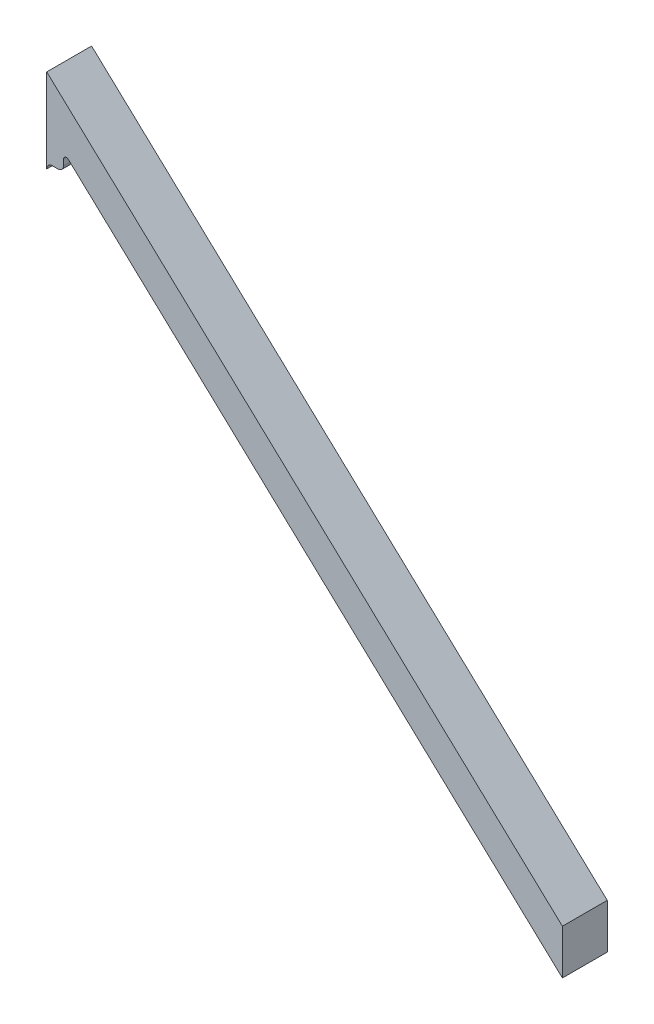
ISO-10303-21;
HEADER;
FILE_DESCRIPTION(('STEP AP214'),'2;1');
FILE_NAME('part.step','',(''),(''),'','','');
FILE_SCHEMA(('AUTOMOTIVE_DESIGN { 1 0 10303 214 1 1 1 1 }'));
ENDSEC;
DATA;
#1=APPLICATION_CONTEXT('core data for automotive mechanical design processes');
#2=APPLICATION_PROTOCOL_DEFINITION('international standard','automotive_design',2000,#1);
#3=PRODUCT_CONTEXT('',#1,'mechanical');
#4=PRODUCT('Part','Part','',(#3));
#5=PRODUCT_RELATED_PRODUCT_CATEGORY('part','',(#4));
#6=PRODUCT_DEFINITION_FORMATION('','',#4);
#7=PRODUCT_DEFINITION_CONTEXT('part definition',#1,'design');
#8=PRODUCT_DEFINITION('design','',#6,#7);
#9=PRODUCT_DEFINITION_SHAPE('','',#8);
#10=(LENGTH_UNIT() NAMED_UNIT(*) SI_UNIT(.MILLI.,.METRE.));
#11=(NAMED_UNIT(*) PLANE_ANGLE_UNIT() SI_UNIT($,.RADIAN.));
#12=(NAMED_UNIT(*) SI_UNIT($,.STERADIAN.) SOLID_ANGLE_UNIT());
#13=UNCERTAINTY_MEASURE_WITH_UNIT(LENGTH_MEASURE(1.E-05),#10,'distance_accuracy_value','');
#14=(GEOMETRIC_REPRESENTATION_CONTEXT(3) GLOBAL_UNCERTAINTY_ASSIGNED_CONTEXT((#13)) GLOBAL_UNIT_ASSIGNED_CONTEXT((#10,
#11,#12)) REPRESENTATION_CONTEXT('',''));
#15=CARTESIAN_POINT('',(0.,0.,0.));
#16=DIRECTION('',(0.,0.,1.));
#17=DIRECTION('',(1.,0.,0.));
#18=AXIS2_PLACEMENT_3D('',#15,#16,#17);
#19=CARTESIAN_POINT('',(17.7568132742083,196.880197559472,-8.00999999999998));
#20=DIRECTION('',(-1.,0.,0.));
#21=DIRECTION('',(0.,-1.,0.));
#22=AXIS2_PLACEMENT_3D('',#19,#20,#21);
#23=PLANE('',#22);
#24=DIRECTION('',(0.,1.,0.));
#25=VECTOR('',#24,1.);
#26=CARTESIAN_POINT('',(17.7568132742083,192.880197559472,-7.99999999999997));
#27=LINE('',#26,#25);
#28=CARTESIAN_POINT('',(17.7568132742083,181.880197559472,-7.99999999999998));
#29=VERTEX_POINT('',#28);
#30=CARTESIAN_POINT('',(17.7568132742083,196.880197559472,-7.99999999999998));
#31=VERTEX_POINT('',#30);
#32=EDGE_CURVE('E133',#29,#31,#27,.T.);
#33=ORIENTED_EDGE('',*,*,#32,.F.);
#34=DIRECTION('',(0.,0.,1.));
#35=VECTOR('',#34,1.);
#36=CARTESIAN_POINT('',(17.7568132742083,181.880197559472,0.));
#37=LINE('',#36,#35);
#38=CARTESIAN_POINT('',(17.7568132742083,181.880197559472,0.));
#39=VERTEX_POINT('',#38);
#40=EDGE_CURVE('E47',#29,#39,#37,.T.);
#41=ORIENTED_EDGE('',*,*,#40,.T.);
#42=DIRECTION('',(0.,1.,0.));
#43=VECTOR('',#42,1.);
#44=CARTESIAN_POINT('',(17.7568132742083,0.,0.));
#45=LINE('',#44,#43);
#46=CARTESIAN_POINT('',(17.7568132742083,196.880197559472,0.));
#47=VERTEX_POINT('',#46);
#48=EDGE_CURVE('E130',#39,#47,#45,.T.);
#49=ORIENTED_EDGE('',*,*,#48,.T.);
#50=DIRECTION('',(0.,0.,1.));
#51=VECTOR('',#50,1.);
#52=CARTESIAN_POINT('',(17.7568132742083,196.880197559472,-174.481230173254));
#53=LINE('',#52,#51);
#54=EDGE_CURVE('E62',#31,#47,#53,.T.);
#55=ORIENTED_EDGE('',*,*,#54,.F.);
#56=EDGE_LOOP('',(#33,#41,#49,#55));
#57=FACE_BOUND('',#56,.T.);
#58=ADVANCED_FACE('F43',(#57),#23,.T.);
#59=CARTESIAN_POINT('',(9.75681327420833,192.880197559472,-7.99999999999997));
#60=DIRECTION('',(0.,0.,-1.));
#61=DIRECTION('',(0.,-1.,0.));
#62=AXIS2_PLACEMENT_3D('',#59,#60,#61);
#63=PLANE('',#62);
#64=CARTESIAN_POINT('',(18.7568132742083,181.880197559472,-7.99999999999998));
#65=DIRECTION('',(0.,0.,-1.));
#66=DIRECTION('',(0.,1.,0.));
#67=AXIS2_PLACEMENT_3D('',#64,#65,#66);
#68=CIRCLE('',#67,1.);
#69=CARTESIAN_POINT('',(18.7568132742083,182.880197559472,-7.99999999999998));
#70=VERTEX_POINT('',#69);
#71=EDGE_CURVE('E127',#70,#29,#68,.F.);
#72=ORIENTED_EDGE('',*,*,#71,.T.);
#73=ORIENTED_EDGE('',*,*,#32,.T.);
#74=DIRECTION('',(-0.730526939324927,0.682883878064606,0.));
#75=VECTOR('',#74,1.);
#76=CARTESIAN_POINT('',(17.7568132742084,196.880197559472,-7.99999999999998));
#77=LINE('',#76,#75);
#78=CARTESIAN_POINT('',(109.756813274208,110.880197559472,-7.99999999999998));
#79=VERTEX_POINT('',#78);
#80=EDGE_CURVE('E141',#79,#31,#77,.T.);
#81=ORIENTED_EDGE('',*,*,#80,.F.);
#82=DIRECTION('',(0.,1.,0.));
#83=VECTOR('',#82,1.);
#84=CARTESIAN_POINT('',(109.756813274208,110.880197559472,-7.99999999999998));
#85=LINE('',#84,#83);
#86=CARTESIAN_POINT('',(109.756813274208,102.880197559472,-7.99999999999998));
#87=VERTEX_POINT('',#86);
#88=EDGE_CURVE('E160',#87,#79,#85,.T.);
#89=ORIENTED_EDGE('',*,*,#88,.F.);
#90=DIRECTION('',(0.730526939324927,-0.682883878064605,0.));
#91=VECTOR('',#90,1.);
#92=CARTESIAN_POINT('',(20.7568132742084,186.075849733385,-7.99999999999998));
#93=LINE('',#92,#91);
#94=CARTESIAN_POINT('',(21.5982552132406,185.289284442551,-7.99999999999998));
#95=VERTEX_POINT('',#94);
#96=EDGE_CURVE('E145',#95,#87,#93,.T.);
#97=ORIENTED_EDGE('',*,*,#96,.F.);
#98=CARTESIAN_POINT('',(21.2568132742083,184.924020972888,-7.99999999999998));
#99=DIRECTION('',(0.,0.,-1.));
#100=DIRECTION('',(0.,1.,0.));
#101=AXIS2_PLACEMENT_3D('',#98,#99,#100);
#102=CIRCLE('',#101,0.5);
#103=CARTESIAN_POINT('',(20.7568132742083,184.924020972888,-7.99999999999998));
#104=VERTEX_POINT('',#103);
#105=EDGE_CURVE('E135',#95,#104,#102,.F.);
#106=ORIENTED_EDGE('',*,*,#105,.T.);
#107=DIRECTION('',(0.,1.,0.));
#108=VECTOR('',#107,1.);
#109=CARTESIAN_POINT('',(20.7568132742083,186.075849733385,-7.99999999999998));
#110=LINE('',#109,#108);
#111=CARTESIAN_POINT('',(20.7568132742083,183.880197559472,-7.99999999999998));
#112=VERTEX_POINT('',#111);
#113=EDGE_CURVE('E153',#112,#104,#110,.T.);
#114=ORIENTED_EDGE('',*,*,#113,.F.);
#115=CARTESIAN_POINT('',(19.7568132742083,183.880197559472,-7.99999999999998));
#116=DIRECTION('',(0.,0.,-1.));
#117=DIRECTION('',(0.,1.,0.));
#118=AXIS2_PLACEMENT_3D('',#115,#116,#117);
#119=CIRCLE('',#118,1.);
#120=CARTESIAN_POINT('',(19.7568132742083,182.880197559472,-7.99999999999998));
#121=VERTEX_POINT('',#120);
#122=EDGE_CURVE('E167',#112,#121,#119,.T.);
#123=ORIENTED_EDGE('',*,*,#122,.T.);
#124=DIRECTION('',(1.,0.,0.));
#125=VECTOR('',#124,1.);
#126=CARTESIAN_POINT('',(20.7568132742083,182.880197559472,-7.99999999999998));
#127=LINE('',#126,#125);
#128=EDGE_CURVE('E142',#70,#121,#127,.T.);
#129=ORIENTED_EDGE('',*,*,#128,.F.);
#130=EDGE_LOOP('',(#72,#73,#81,#89,#97,#106,#114,#123,#129));
#131=FACE_BOUND('',#130,.T.);
#132=ADVANCED_FACE('F192',(#131),#63,.T.);
#133=CARTESIAN_POINT('',(0.,0.,0.));
#134=DIRECTION('',(0.,0.,-1.));
#135=DIRECTION('',(-1.,0.,0.));
#136=AXIS2_PLACEMENT_3D('',#133,#134,#135);
#137=PLANE('',#136);
#138=ORIENTED_EDGE('',*,*,#48,.F.);
#139=CARTESIAN_POINT('',(18.7568132742083,181.880197559472,0.));
#140=DIRECTION('',(0.,0.,-1.));
#141=DIRECTION('',(-1.,0.,0.));
#142=AXIS2_PLACEMENT_3D('',#139,#140,#141);
#143=CIRCLE('',#142,1.);
#144=CARTESIAN_POINT('',(18.7568132742083,182.880197559472,0.));
#145=VERTEX_POINT('',#144);
#146=EDGE_CURVE('E119',#39,#145,#143,.T.);
#147=ORIENTED_EDGE('',*,*,#146,.T.);
#148=DIRECTION('',(1.,0.,0.));
#149=VECTOR('',#148,1.);
#150=CARTESIAN_POINT('',(20.7568132742083,182.880197559472,0.));
#151=LINE('',#150,#149);
#152=CARTESIAN_POINT('',(19.7568132742083,182.880197559472,0.));
#153=VERTEX_POINT('',#152);
#154=EDGE_CURVE('E143',#145,#153,#151,.T.);
#155=ORIENTED_EDGE('',*,*,#154,.T.);
#156=CARTESIAN_POINT('',(19.7568132742083,183.880197559472,0.));
#157=DIRECTION('',(0.,0.,-1.));
#158=DIRECTION('',(-1.,0.,0.));
#159=AXIS2_PLACEMENT_3D('',#156,#157,#158);
#160=CIRCLE('',#159,1.);
#161=CARTESIAN_POINT('',(20.7568132742083,183.880197559472,0.));
#162=VERTEX_POINT('',#161);
#163=EDGE_CURVE('E83',#153,#162,#160,.F.);
#164=ORIENTED_EDGE('',*,*,#163,.T.);
#165=DIRECTION('',(0.,1.,0.));
#166=VECTOR('',#165,1.);
#167=CARTESIAN_POINT('',(20.7568132742083,186.075849733385,0.));
#168=LINE('',#167,#166);
#169=CARTESIAN_POINT('',(20.7568132742083,184.924020972888,0.));
#170=VERTEX_POINT('',#169);
#171=EDGE_CURVE('E11',#162,#170,#168,.T.);
#172=ORIENTED_EDGE('',*,*,#171,.T.);
#173=CARTESIAN_POINT('',(21.2568132742083,184.924020972888,0.));
#174=DIRECTION('',(0.,0.,-1.));
#175=DIRECTION('',(-1.,0.,0.));
#176=AXIS2_PLACEMENT_3D('',#173,#174,#175);
#177=CIRCLE('',#176,0.5);
#178=CARTESIAN_POINT('',(21.5982552132406,185.289284442551,0.));
#179=VERTEX_POINT('',#178);
#180=EDGE_CURVE('E137',#170,#179,#177,.T.);
#181=ORIENTED_EDGE('',*,*,#180,.T.);
#182=DIRECTION('',(0.730526939324927,-0.682883878064605,0.));
#183=VECTOR('',#182,1.);
#184=CARTESIAN_POINT('',(20.7568132742083,186.075849733385,0.));
#185=LINE('',#184,#183);
#186=CARTESIAN_POINT('',(109.756813274208,102.880197559472,0.));
#187=VERTEX_POINT('',#186);
#188=EDGE_CURVE('E53',#179,#187,#185,.T.);
#189=ORIENTED_EDGE('',*,*,#188,.T.);
#190=DIRECTION('',(0.,1.,0.));
#191=VECTOR('',#190,1.);
#192=CARTESIAN_POINT('',(109.756813274208,110.880197559472,0.));
#193=LINE('',#192,#191);
#194=CARTESIAN_POINT('',(109.756813274208,110.880197559472,0.));
#195=VERTEX_POINT('',#194);
#196=EDGE_CURVE('E147',#187,#195,#193,.T.);
#197=ORIENTED_EDGE('',*,*,#196,.T.);
#198=DIRECTION('',(-0.730526939324927,0.682883878064606,0.));
#199=VECTOR('',#198,1.);
#200=CARTESIAN_POINT('',(17.7568132742083,196.880197559472,0.));
#201=LINE('',#200,#199);
#202=EDGE_CURVE('E132',#195,#47,#201,.T.);
#203=ORIENTED_EDGE('',*,*,#202,.T.);
#204=EDGE_LOOP('',(#138,#147,#155,#164,#172,#181,#189,#197,#203));
#205=FACE_BOUND('',#204,.T.);
#206=ADVANCED_FACE('F45',(#205),#137,.F.);
#207=CARTESIAN_POINT('',(20.7568132742083,186.075849733385,-174.481230173254));
#208=DIRECTION('',(-0.682883878064605,-0.730526939324927,0.));
#209=DIRECTION('',(0.730526939324927,-0.682883878064605,0.));
#210=AXIS2_PLACEMENT_3D('',#207,#208,#209);
#211=PLANE('',#210);
#212=ORIENTED_EDGE('',*,*,#188,.F.);
#213=DIRECTION('',(0.,0.,1.));
#214=VECTOR('',#213,1.);
#215=CARTESIAN_POINT('',(21.5982552132406,185.289284442551,-7.99999999999998));
#216=LINE('',#215,#214);
#217=EDGE_CURVE('E126',#179,#95,#216,.F.);
#218=ORIENTED_EDGE('',*,*,#217,.T.);
#219=ORIENTED_EDGE('',*,*,#96,.T.);
#220=DIRECTION('',(0.,0.,1.));
#221=VECTOR('',#220,1.);
#222=CARTESIAN_POINT('',(109.756813274208,102.880197559472,-174.481230173254));
#223=LINE('',#222,#221);
#224=EDGE_CURVE('E152',#87,#187,#223,.T.);
#225=ORIENTED_EDGE('',*,*,#224,.T.);
#226=EDGE_LOOP('',(#212,#218,#219,#225));
#227=FACE_BOUND('',#226,.T.);
#228=ADVANCED_FACE('F185',(#227),#211,.T.);
#229=CARTESIAN_POINT('',(109.756813274208,110.880197559472,-174.481230173254));
#230=DIRECTION('',(1.,0.,0.));
#231=DIRECTION('',(0.,0.,-1.));
#232=AXIS2_PLACEMENT_3D('',#229,#230,#231);
#233=PLANE('',#232);
#234=ORIENTED_EDGE('',*,*,#224,.F.);
#235=ORIENTED_EDGE('',*,*,#88,.T.);
#236=DIRECTION('',(0.,0.,1.));
#237=VECTOR('',#236,1.);
#238=CARTESIAN_POINT('',(109.756813274208,110.880197559472,-174.481230173254));
#239=LINE('',#238,#237);
#240=EDGE_CURVE('E159',#79,#195,#239,.T.);
#241=ORIENTED_EDGE('',*,*,#240,.T.);
#242=ORIENTED_EDGE('',*,*,#196,.F.);
#243=EDGE_LOOP('',(#234,#235,#241,#242));
#244=FACE_BOUND('',#243,.T.);
#245=ADVANCED_FACE('F212',(#244),#233,.T.);
#246=CARTESIAN_POINT('',(17.7568132742083,196.880197559472,-174.481230173254));
#247=DIRECTION('',(0.682883878064605,0.730526939324927,0.));
#248=DIRECTION('',(-0.730526939324927,0.682883878064606,0.));
#249=AXIS2_PLACEMENT_3D('',#246,#247,#248);
#250=PLANE('',#249);
#251=ORIENTED_EDGE('',*,*,#240,.F.);
#252=ORIENTED_EDGE('',*,*,#80,.T.);
#253=ORIENTED_EDGE('',*,*,#54,.T.);
#254=ORIENTED_EDGE('',*,*,#202,.F.);
#255=EDGE_LOOP('',(#251,#252,#253,#254));
#256=FACE_BOUND('',#255,.T.);
#257=ADVANCED_FACE('F205',(#256),#250,.T.);
#258=CARTESIAN_POINT('',(20.7568132742083,182.880197559472,-174.481230173254));
#259=DIRECTION('',(0.,-1.,0.));
#260=DIRECTION('',(0.,0.,-1.));
#261=AXIS2_PLACEMENT_3D('',#258,#259,#260);
#262=PLANE('',#261);
#263=ORIENTED_EDGE('',*,*,#154,.F.);
#264=DIRECTION('',(0.,0.,1.));
#265=VECTOR('',#264,1.);
#266=CARTESIAN_POINT('',(18.7568132742083,182.880197559472,-7.99999999999998));
#267=LINE('',#266,#265);
#268=EDGE_CURVE('E124',#145,#70,#267,.F.);
#269=ORIENTED_EDGE('',*,*,#268,.T.);
#270=ORIENTED_EDGE('',*,*,#128,.T.);
#271=DIRECTION('',(0.,0.,1.));
#272=VECTOR('',#271,1.);
#273=CARTESIAN_POINT('',(19.7568132742083,182.880197559472,-174.481230173254));
#274=LINE('',#273,#272);
#275=EDGE_CURVE('E169',#121,#153,#274,.T.);
#276=ORIENTED_EDGE('',*,*,#275,.T.);
#277=EDGE_LOOP('',(#263,#269,#270,#276));
#278=FACE_BOUND('',#277,.T.);
#279=ADVANCED_FACE('F203',(#278),#262,.T.);
#280=CARTESIAN_POINT('',(20.7568132742083,186.075849733385,-174.481230173254));
#281=DIRECTION('',(1.,0.,0.));
#282=DIRECTION('',(0.,0.,-1.));
#283=AXIS2_PLACEMENT_3D('',#280,#281,#282);
#284=PLANE('',#283);
#285=ORIENTED_EDGE('',*,*,#171,.F.);
#286=DIRECTION('',(0.,0.,1.));
#287=VECTOR('',#286,1.);
#288=CARTESIAN_POINT('',(20.7568132742083,183.880197559472,-174.481230173254));
#289=LINE('',#288,#287);
#290=EDGE_CURVE('E176',#162,#112,#289,.F.);
#291=ORIENTED_EDGE('',*,*,#290,.T.);
#292=ORIENTED_EDGE('',*,*,#113,.T.);
#293=DIRECTION('',(0.,0.,1.));
#294=VECTOR('',#293,1.);
#295=CARTESIAN_POINT('',(20.7568132742083,184.924020972888,0.));
#296=LINE('',#295,#294);
#297=EDGE_CURVE('E173',#104,#170,#296,.T.);
#298=ORIENTED_EDGE('',*,*,#297,.T.);
#299=EDGE_LOOP('',(#285,#291,#292,#298));
#300=FACE_BOUND('',#299,.T.);
#301=ADVANCED_FACE('F196',(#300),#284,.T.);
#302=CARTESIAN_POINT('',(18.7568132742083,181.880197559472,-174.481230173254));
#303=DIRECTION('',(0.,0.,-1.));
#304=DIRECTION('',(-1.,0.,0.));
#305=AXIS2_PLACEMENT_3D('',#302,#303,#304);
#306=CYLINDRICAL_SURFACE('',#305,1.);
#307=ORIENTED_EDGE('',*,*,#71,.F.);
#308=ORIENTED_EDGE('',*,*,#268,.F.);
#309=ORIENTED_EDGE('',*,*,#146,.F.);
#310=ORIENTED_EDGE('',*,*,#40,.F.);
#311=EDGE_LOOP('',(#307,#308,#309,#310));
#312=FACE_BOUND('',#311,.T.);
#313=ADVANCED_FACE('F122',(#312),#306,.F.);
#314=CARTESIAN_POINT('',(19.7568132742083,183.880197559472,-174.481230173254));
#315=DIRECTION('',(0.,0.,1.));
#316=DIRECTION('',(1.,0.,0.));
#317=AXIS2_PLACEMENT_3D('',#314,#315,#316);
#318=CYLINDRICAL_SURFACE('',#317,1.);
#319=ORIENTED_EDGE('',*,*,#122,.F.);
#320=ORIENTED_EDGE('',*,*,#290,.F.);
#321=ORIENTED_EDGE('',*,*,#163,.F.);
#322=ORIENTED_EDGE('',*,*,#275,.F.);
#323=EDGE_LOOP('',(#319,#320,#321,#322));
#324=FACE_BOUND('',#323,.T.);
#325=ADVANCED_FACE('F199',(#324),#318,.T.);
#326=CARTESIAN_POINT('',(21.2568132742083,184.924020972888,-174.481230173254));
#327=DIRECTION('',(0.,0.,-1.));
#328=DIRECTION('',(-1.,0.,0.));
#329=AXIS2_PLACEMENT_3D('',#326,#327,#328);
#330=CYLINDRICAL_SURFACE('',#329,0.5);
#331=ORIENTED_EDGE('',*,*,#105,.F.);
#332=ORIENTED_EDGE('',*,*,#217,.F.);
#333=ORIENTED_EDGE('',*,*,#180,.F.);
#334=ORIENTED_EDGE('',*,*,#297,.F.);
#335=EDGE_LOOP('',(#331,#332,#333,#334));
#336=FACE_BOUND('',#335,.T.);
#337=ADVANCED_FACE('F190',(#336),#330,.F.);
#338=CLOSED_SHELL('',(#58,#132,#206,#228,#245,#257,#279,#301,#313,#325,#337));
#339=MANIFOLD_SOLID_BREP('B2',#338);
#340=ADVANCED_BREP_SHAPE_REPRESENTATION('',(#18,#339),#14);
#341=SHAPE_DEFINITION_REPRESENTATION(#9,#340);
ENDSEC;
END-ISO-10303-21;
